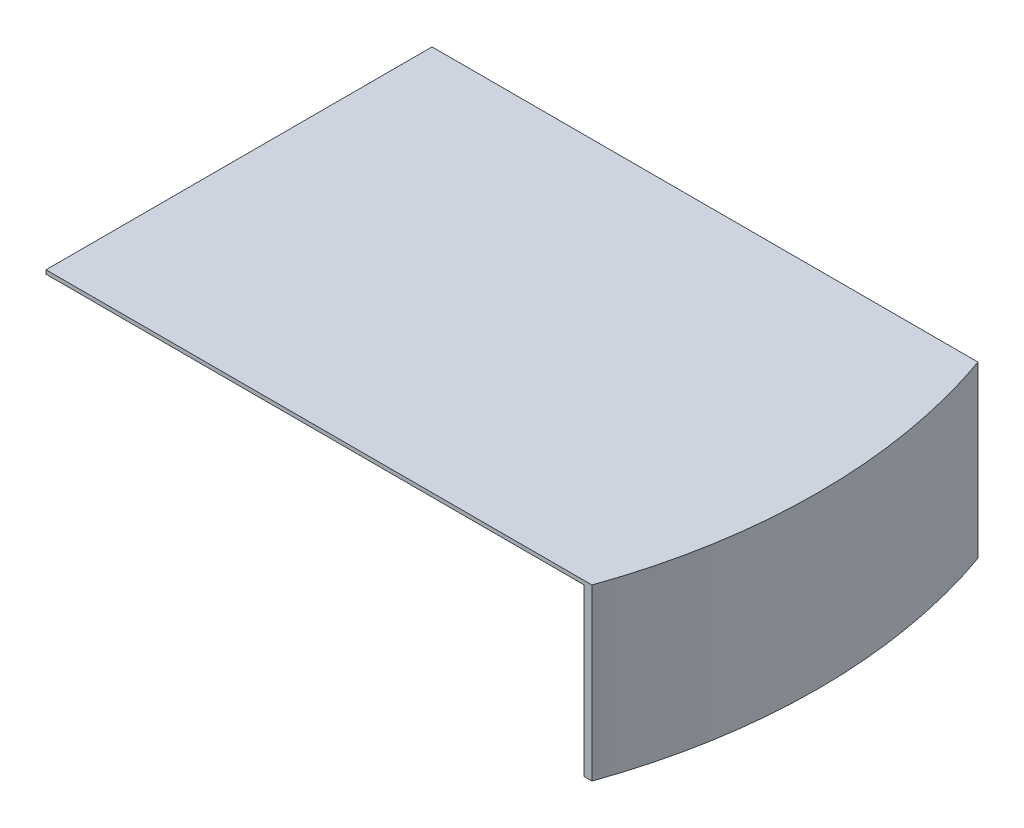
ISO-10303-21;
HEADER;
FILE_DESCRIPTION(('STEP AP214'),'2;1');
FILE_NAME('part.step','',(''),(''),'','','');
FILE_SCHEMA(('AUTOMOTIVE_DESIGN { 1 0 10303 214 1 1 1 1 }'));
ENDSEC;
DATA;
#1=APPLICATION_CONTEXT('core data for automotive mechanical design processes');
#2=APPLICATION_PROTOCOL_DEFINITION('international standard','automotive_design',2000,#1);
#3=PRODUCT_CONTEXT('',#1,'mechanical');
#4=PRODUCT('Part','Part','',(#3));
#5=PRODUCT_RELATED_PRODUCT_CATEGORY('part','',(#4));
#6=PRODUCT_DEFINITION_FORMATION('','',#4);
#7=PRODUCT_DEFINITION_CONTEXT('part definition',#1,'design');
#8=PRODUCT_DEFINITION('design','',#6,#7);
#9=PRODUCT_DEFINITION_SHAPE('','',#8);
#10=(LENGTH_UNIT() NAMED_UNIT(*) SI_UNIT(.MILLI.,.METRE.));
#11=(NAMED_UNIT(*) PLANE_ANGLE_UNIT() SI_UNIT($,.RADIAN.));
#12=(NAMED_UNIT(*) SI_UNIT($,.STERADIAN.) SOLID_ANGLE_UNIT());
#13=UNCERTAINTY_MEASURE_WITH_UNIT(LENGTH_MEASURE(1.E-05),#10,'distance_accuracy_value','');
#14=(GEOMETRIC_REPRESENTATION_CONTEXT(3) GLOBAL_UNCERTAINTY_ASSIGNED_CONTEXT((#13)) GLOBAL_UNIT_ASSIGNED_CONTEXT((#10,
#11,#12)) REPRESENTATION_CONTEXT('',''));
#15=CARTESIAN_POINT('',(0.,0.,0.));
#16=DIRECTION('',(0.,0.,1.));
#17=DIRECTION('',(1.,0.,0.));
#18=AXIS2_PLACEMENT_3D('',#15,#16,#17);
#19=CARTESIAN_POINT('',(0.,44.,50.));
#20=DIRECTION('',(0.,0.,-1.));
#21=DIRECTION('',(-1.,0.,0.));
#22=AXIS2_PLACEMENT_3D('',#19,#20,#21);
#23=PLANE('',#22);
#24=DIRECTION('',(-1.,0.,0.));
#25=VECTOR('',#24,1.);
#26=CARTESIAN_POINT('',(0.,43.,50.));
#27=LINE('',#26,#25);
#28=CARTESIAN_POINT('',(139.298241194927,43.,50.));
#29=VERTEX_POINT('',#28);
#30=CARTESIAN_POINT('',(0.,43.,50.));
#31=VERTEX_POINT('',#30);
#32=EDGE_CURVE('E108',#29,#31,#27,.T.);
#33=ORIENTED_EDGE('',*,*,#32,.F.);
#34=DIRECTION('',(0.,-1.,0.));
#35=VECTOR('',#34,1.);
#36=CARTESIAN_POINT('',(139.298241194927,42.,50.));
#37=LINE('',#36,#35);
#38=CARTESIAN_POINT('',(139.298241194927,0.,50.));
#39=VERTEX_POINT('',#38);
#40=EDGE_CURVE('E127',#29,#39,#37,.T.);
#41=ORIENTED_EDGE('',*,*,#40,.T.);
#42=DIRECTION('',(1.,0.,0.));
#43=VECTOR('',#42,1.);
#44=CARTESIAN_POINT('',(0.,0.,50.));
#45=LINE('',#44,#43);
#46=CARTESIAN_POINT('',(141.42135623731,0.,50.));
#47=VERTEX_POINT('',#46);
#48=EDGE_CURVE('E130',#39,#47,#45,.T.);
#49=ORIENTED_EDGE('',*,*,#48,.T.);
#50=DIRECTION('',(0.,-1.,0.));
#51=VECTOR('',#50,1.);
#52=CARTESIAN_POINT('',(141.42135623731,44.,50.));
#53=LINE('',#52,#51);
#54=CARTESIAN_POINT('',(141.42135623731,44.,50.));
#55=VERTEX_POINT('',#54);
#56=EDGE_CURVE('E39',#55,#47,#53,.T.);
#57=ORIENTED_EDGE('',*,*,#56,.F.);
#58=DIRECTION('',(1.,0.,0.));
#59=VECTOR('',#58,1.);
#60=CARTESIAN_POINT('',(0.,44.,50.));
#61=LINE('',#60,#59);
#62=CARTESIAN_POINT('',(0.,44.,50.));
#63=VERTEX_POINT('',#62);
#64=EDGE_CURVE('E138',#63,#55,#61,.T.);
#65=ORIENTED_EDGE('',*,*,#64,.F.);
#66=DIRECTION('',(0.,-1.,0.));
#67=VECTOR('',#66,1.);
#68=CARTESIAN_POINT('',(0.,44.,50.));
#69=LINE('',#68,#67);
#70=EDGE_CURVE('E11',#63,#31,#69,.T.);
#71=ORIENTED_EDGE('',*,*,#70,.T.);
#72=EDGE_LOOP('',(#33,#41,#49,#57,#65,#71));
#73=FACE_BOUND('',#72,.T.);
#74=ADVANCED_FACE('F32',(#73),#23,.F.);
#75=CARTESIAN_POINT('',(0.,44.,0.));
#76=DIRECTION('',(0.,-1.,0.));
#77=DIRECTION('',(0.,0.,-1.));
#78=AXIS2_PLACEMENT_3D('',#75,#76,#77);
#79=CYLINDRICAL_SURFACE('',#78,150.);
#80=CARTESIAN_POINT('',(0.,0.,0.));
#81=DIRECTION('',(0.,1.,0.));
#82=DIRECTION('',(0.,0.,1.));
#83=AXIS2_PLACEMENT_3D('',#80,#81,#82);
#84=CIRCLE('',#83,150.);
#85=CARTESIAN_POINT('',(141.42135623731,0.,-50.));
#86=VERTEX_POINT('',#85);
#87=EDGE_CURVE('E148',#47,#86,#84,.T.);
#88=ORIENTED_EDGE('',*,*,#87,.T.);
#89=DIRECTION('',(0.,-1.,0.));
#90=VECTOR('',#89,1.);
#91=CARTESIAN_POINT('',(141.42135623731,44.,-50.));
#92=LINE('',#91,#90);
#93=CARTESIAN_POINT('',(141.42135623731,44.,-50.));
#94=VERTEX_POINT('',#93);
#95=EDGE_CURVE('E153',#94,#86,#92,.T.);
#96=ORIENTED_EDGE('',*,*,#95,.F.);
#97=CARTESIAN_POINT('',(0.,44.,0.));
#98=DIRECTION('',(0.,1.,0.));
#99=DIRECTION('',(0.,0.,1.));
#100=AXIS2_PLACEMENT_3D('',#97,#98,#99);
#101=CIRCLE('',#100,150.);
#102=EDGE_CURVE('E141',#55,#94,#101,.T.);
#103=ORIENTED_EDGE('',*,*,#102,.F.);
#104=ORIENTED_EDGE('',*,*,#56,.T.);
#105=EDGE_LOOP('',(#88,#96,#103,#104));
#106=FACE_BOUND('',#105,.T.);
#107=ADVANCED_FACE('F160',(#106),#79,.T.);
#108=CARTESIAN_POINT('',(0.,44.,-50.));
#109=DIRECTION('',(0.,0.,1.));
#110=DIRECTION('',(1.,0.,0.));
#111=AXIS2_PLACEMENT_3D('',#108,#109,#110);
#112=PLANE('',#111);
#113=DIRECTION('',(0.,-1.,0.));
#114=VECTOR('',#113,1.);
#115=CARTESIAN_POINT('',(139.298241194927,42.,-50.));
#116=LINE('',#115,#114);
#117=CARTESIAN_POINT('',(139.298241194927,42.,-50.));
#118=VERTEX_POINT('',#117);
#119=CARTESIAN_POINT('',(139.298241194927,0.,-50.));
#120=VERTEX_POINT('',#119);
#121=EDGE_CURVE('E54',#118,#120,#116,.T.);
#122=ORIENTED_EDGE('',*,*,#121,.F.);
#123=DIRECTION('',(-1.,0.,0.));
#124=VECTOR('',#123,1.);
#125=CARTESIAN_POINT('',(0.,42.,-50.));
#126=LINE('',#125,#124);
#127=CARTESIAN_POINT('',(0.,42.,-50.));
#128=VERTEX_POINT('',#127);
#129=EDGE_CURVE('E125',#118,#128,#126,.T.);
#130=ORIENTED_EDGE('',*,*,#129,.T.);
#131=DIRECTION('',(0.,-1.,0.));
#132=VECTOR('',#131,1.);
#133=CARTESIAN_POINT('',(0.,44.,-50.));
#134=LINE('',#133,#132);
#135=CARTESIAN_POINT('',(0.,44.,-50.));
#136=VERTEX_POINT('',#135);
#137=EDGE_CURVE('E146',#136,#128,#134,.T.);
#138=ORIENTED_EDGE('',*,*,#137,.F.);
#139=DIRECTION('',(-1.,0.,0.));
#140=VECTOR('',#139,1.);
#141=CARTESIAN_POINT('',(0.,44.,-50.));
#142=LINE('',#141,#140);
#143=EDGE_CURVE('E143',#94,#136,#142,.T.);
#144=ORIENTED_EDGE('',*,*,#143,.F.);
#145=ORIENTED_EDGE('',*,*,#95,.T.);
#146=DIRECTION('',(-1.,0.,0.));
#147=VECTOR('',#146,1.);
#148=CARTESIAN_POINT('',(0.,0.,-50.));
#149=LINE('',#148,#147);
#150=EDGE_CURVE('E139',#86,#120,#149,.T.);
#151=ORIENTED_EDGE('',*,*,#150,.T.);
#152=EDGE_LOOP('',(#122,#130,#138,#144,#145,#151));
#153=FACE_BOUND('',#152,.T.);
#154=ADVANCED_FACE('F168',(#153),#112,.F.);
#155=CARTESIAN_POINT('',(0.,44.,0.));
#156=DIRECTION('',(1.,0.,0.));
#157=DIRECTION('',(0.,0.,-1.));
#158=AXIS2_PLACEMENT_3D('',#155,#156,#157);
#159=PLANE('',#158);
#160=DIRECTION('',(0.,0.,1.));
#161=VECTOR('',#160,1.);
#162=CARTESIAN_POINT('',(0.,42.,0.));
#163=LINE('',#162,#161);
#164=CARTESIAN_POINT('',(0.,42.,30.));
#165=VERTEX_POINT('',#164);
#166=EDGE_CURVE('E116',#128,#165,#163,.T.);
#167=ORIENTED_EDGE('',*,*,#166,.T.);
#168=DIRECTION('',(0.,-1.,0.));
#169=VECTOR('',#168,1.);
#170=CARTESIAN_POINT('',(0.,43.,30.));
#171=LINE('',#170,#169);
#172=CARTESIAN_POINT('',(0.,43.,30.));
#173=VERTEX_POINT('',#172);
#174=EDGE_CURVE('E46',#173,#165,#171,.T.);
#175=ORIENTED_EDGE('',*,*,#174,.F.);
#176=DIRECTION('',(0.,0.,-1.));
#177=VECTOR('',#176,1.);
#178=CARTESIAN_POINT('',(0.,43.,30.));
#179=LINE('',#178,#177);
#180=EDGE_CURVE('E103',#31,#173,#179,.T.);
#181=ORIENTED_EDGE('',*,*,#180,.F.);
#182=ORIENTED_EDGE('',*,*,#70,.F.);
#183=DIRECTION('',(0.,0.,1.));
#184=VECTOR('',#183,1.);
#185=CARTESIAN_POINT('',(0.,44.,0.));
#186=LINE('',#185,#184);
#187=EDGE_CURVE('E135',#136,#63,#186,.T.);
#188=ORIENTED_EDGE('',*,*,#187,.F.);
#189=ORIENTED_EDGE('',*,*,#137,.T.);
#190=EDGE_LOOP('',(#167,#175,#181,#182,#188,#189));
#191=FACE_BOUND('',#190,.T.);
#192=ADVANCED_FACE('F114',(#191),#159,.F.);
#193=CARTESIAN_POINT('',(0.,44.,0.));
#194=DIRECTION('',(0.,1.,0.));
#195=DIRECTION('',(0.,0.,1.));
#196=AXIS2_PLACEMENT_3D('',#193,#194,#195);
#197=PLANE('',#196);
#198=ORIENTED_EDGE('',*,*,#187,.T.);
#199=ORIENTED_EDGE('',*,*,#64,.T.);
#200=ORIENTED_EDGE('',*,*,#102,.T.);
#201=ORIENTED_EDGE('',*,*,#143,.T.);
#202=EDGE_LOOP('',(#198,#199,#200,#201));
#203=FACE_BOUND('',#202,.T.);
#204=ADVANCED_FACE('F172',(#203),#197,.T.);
#205=CARTESIAN_POINT('',(0.,0.,0.));
#206=DIRECTION('',(0.,1.,0.));
#207=DIRECTION('',(0.,0.,1.));
#208=AXIS2_PLACEMENT_3D('',#205,#206,#207);
#209=PLANE('',#208);
#210=ORIENTED_EDGE('',*,*,#48,.F.);
#211=CARTESIAN_POINT('',(0.,0.,0.));
#212=DIRECTION('',(0.,1.,0.));
#213=DIRECTION('',(0.,0.,1.));
#214=AXIS2_PLACEMENT_3D('',#211,#212,#213);
#215=CIRCLE('',#214,148.);
#216=EDGE_CURVE('E118',#39,#120,#215,.T.);
#217=ORIENTED_EDGE('',*,*,#216,.T.);
#218=ORIENTED_EDGE('',*,*,#150,.F.);
#219=ORIENTED_EDGE('',*,*,#87,.F.);
#220=EDGE_LOOP('',(#210,#217,#218,#219));
#221=FACE_BOUND('',#220,.T.);
#222=ADVANCED_FACE('F166',(#221),#209,.F.);
#223=CARTESIAN_POINT('',(0.,44.,0.));
#224=DIRECTION('',(0.,-1.,0.));
#225=DIRECTION('',(0.,0.,-1.));
#226=AXIS2_PLACEMENT_3D('',#223,#224,#225);
#227=CYLINDRICAL_SURFACE('',#226,148.);
#228=ORIENTED_EDGE('',*,*,#216,.F.);
#229=ORIENTED_EDGE('',*,*,#40,.F.);
#230=CARTESIAN_POINT('',(-7.24420523567915E-12,43.,-2.06085148946045E-12));
#231=DIRECTION('',(0.,-1.,0.));
#232=DIRECTION('',(0.,0.,-1.));
#233=AXIS2_PLACEMENT_3D('',#230,#231,#232);
#234=CIRCLE('',#233,148.000000000008);
#235=CARTESIAN_POINT('',(144.927568115939,43.,30.));
#236=VERTEX_POINT('',#235);
#237=EDGE_CURVE('E102',#236,#29,#234,.T.);
#238=ORIENTED_EDGE('',*,*,#237,.F.);
#239=DIRECTION('',(0.,-1.,0.));
#240=VECTOR('',#239,1.);
#241=CARTESIAN_POINT('',(144.927568115939,43.,30.));
#242=LINE('',#241,#240);
#243=CARTESIAN_POINT('',(144.927568115939,42.,30.));
#244=VERTEX_POINT('',#243);
#245=EDGE_CURVE('E98',#236,#244,#242,.T.);
#246=ORIENTED_EDGE('',*,*,#245,.T.);
#247=CARTESIAN_POINT('',(0.,42.,0.));
#248=DIRECTION('',(0.,1.,0.));
#249=DIRECTION('',(0.,0.,1.));
#250=AXIS2_PLACEMENT_3D('',#247,#248,#249);
#251=CIRCLE('',#250,148.);
#252=EDGE_CURVE('E123',#244,#118,#251,.T.);
#253=ORIENTED_EDGE('',*,*,#252,.T.);
#254=ORIENTED_EDGE('',*,*,#121,.T.);
#255=EDGE_LOOP('',(#228,#229,#238,#246,#253,#254));
#256=FACE_BOUND('',#255,.T.);
#257=ADVANCED_FACE('F173',(#256),#227,.F.);
#258=CARTESIAN_POINT('',(0.,42.,0.));
#259=DIRECTION('',(0.,1.,0.));
#260=DIRECTION('',(0.,0.,1.));
#261=AXIS2_PLACEMENT_3D('',#258,#259,#260);
#262=PLANE('',#261);
#263=ORIENTED_EDGE('',*,*,#252,.F.);
#264=DIRECTION('',(1.,0.,0.));
#265=VECTOR('',#264,1.);
#266=CARTESIAN_POINT('',(0.,42.,30.));
#267=LINE('',#266,#265);
#268=EDGE_CURVE('E111',#165,#244,#267,.T.);
#269=ORIENTED_EDGE('',*,*,#268,.F.);
#270=ORIENTED_EDGE('',*,*,#166,.F.);
#271=ORIENTED_EDGE('',*,*,#129,.F.);
#272=EDGE_LOOP('',(#263,#269,#270,#271));
#273=FACE_BOUND('',#272,.T.);
#274=ADVANCED_FACE('F178',(#273),#262,.F.);
#275=CARTESIAN_POINT('',(0.,43.,30.));
#276=DIRECTION('',(0.,0.,-1.));
#277=DIRECTION('',(-1.,0.,0.));
#278=AXIS2_PLACEMENT_3D('',#275,#276,#277);
#279=PLANE('',#278);
#280=ORIENTED_EDGE('',*,*,#268,.T.);
#281=ORIENTED_EDGE('',*,*,#245,.F.);
#282=DIRECTION('',(1.,0.,0.));
#283=VECTOR('',#282,1.);
#284=CARTESIAN_POINT('',(0.,43.,30.));
#285=LINE('',#284,#283);
#286=EDGE_CURVE('E95',#173,#236,#285,.T.);
#287=ORIENTED_EDGE('',*,*,#286,.F.);
#288=ORIENTED_EDGE('',*,*,#174,.T.);
#289=EDGE_LOOP('',(#280,#281,#287,#288));
#290=FACE_BOUND('',#289,.T.);
#291=ADVANCED_FACE('F97',(#290),#279,.F.);
#292=CARTESIAN_POINT('',(-7.24420523567915E-12,43.,-2.06085148946045E-12));
#293=DIRECTION('',(0.,-1.,0.));
#294=DIRECTION('',(0.,0.,-1.));
#295=AXIS2_PLACEMENT_3D('',#292,#293,#294);
#296=PLANE('',#295);
#297=ORIENTED_EDGE('',*,*,#180,.T.);
#298=ORIENTED_EDGE('',*,*,#286,.T.);
#299=ORIENTED_EDGE('',*,*,#237,.T.);
#300=ORIENTED_EDGE('',*,*,#32,.T.);
#301=EDGE_LOOP('',(#297,#298,#299,#300));
#302=FACE_BOUND('',#301,.T.);
#303=ADVANCED_FACE('F106',(#302),#296,.T.);
#304=CLOSED_SHELL('',(#74,#107,#154,#192,#204,#222,#257,#274,#291,#303));
#305=MANIFOLD_SOLID_BREP('B2',#304);
#306=ADVANCED_BREP_SHAPE_REPRESENTATION('',(#18,#305),#14);
#307=SHAPE_DEFINITION_REPRESENTATION(#9,#306);
ENDSEC;
END-ISO-10303-21;
